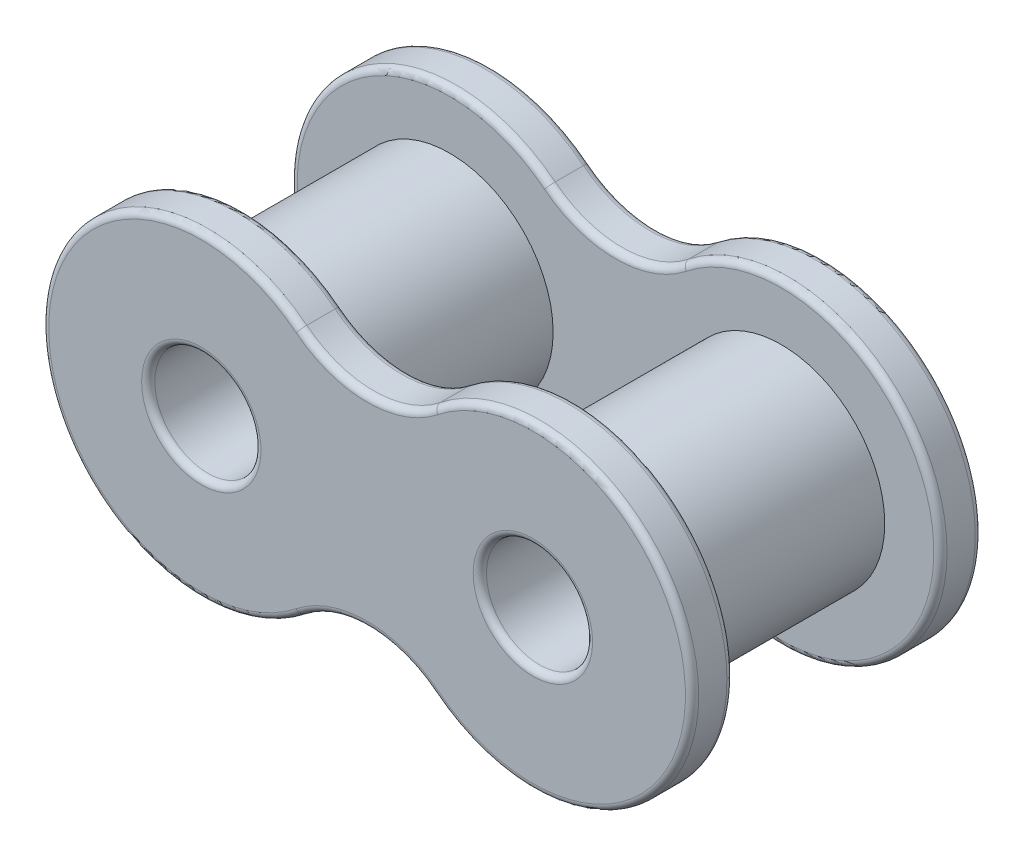
ISO-10303-21;
HEADER;
FILE_DESCRIPTION(('STEP AP214'),'2;1');
FILE_NAME('part.step','',(''),(''),'','','');
FILE_SCHEMA(('AUTOMOTIVE_DESIGN { 1 0 10303 214 1 1 1 1 }'));
ENDSEC;
DATA;
#1=APPLICATION_CONTEXT('core data for automotive mechanical design processes');
#2=APPLICATION_PROTOCOL_DEFINITION('international standard','automotive_design',2000,#1);
#3=PRODUCT_CONTEXT('',#1,'mechanical');
#4=PRODUCT('Part','Part','',(#3));
#5=PRODUCT_RELATED_PRODUCT_CATEGORY('part','',(#4));
#6=PRODUCT_DEFINITION_FORMATION('','',#4);
#7=PRODUCT_DEFINITION_CONTEXT('part definition',#1,'design');
#8=PRODUCT_DEFINITION('design','',#6,#7);
#9=PRODUCT_DEFINITION_SHAPE('','',#8);
#10=(LENGTH_UNIT() NAMED_UNIT(*) SI_UNIT(.MILLI.,.METRE.));
#11=(NAMED_UNIT(*) PLANE_ANGLE_UNIT() SI_UNIT($,.RADIAN.));
#12=(NAMED_UNIT(*) SI_UNIT($,.STERADIAN.) SOLID_ANGLE_UNIT());
#13=UNCERTAINTY_MEASURE_WITH_UNIT(LENGTH_MEASURE(1.E-05),#10,'distance_accuracy_value','');
#14=(GEOMETRIC_REPRESENTATION_CONTEXT(3) GLOBAL_UNCERTAINTY_ASSIGNED_CONTEXT((#13)) GLOBAL_UNIT_ASSIGNED_CONTEXT((#10,
#11,#12)) REPRESENTATION_CONTEXT('',''));
#15=CARTESIAN_POINT('',(0.,0.,0.));
#16=DIRECTION('',(0.,0.,1.));
#17=DIRECTION('',(1.,0.,0.));
#18=AXIS2_PLACEMENT_3D('',#15,#16,#17);
#19=CARTESIAN_POINT('',(3.175,4.,1.5875));
#20=DIRECTION('',(0.,0.,1.));
#21=DIRECTION('',(1.,0.,0.));
#22=AXIS2_PLACEMENT_3D('',#19,#20,#21);
#23=PLANE('',#22);
#24=CARTESIAN_POINT('',(6.35,0.,1.5875));
#25=DIRECTION('',(0.,0.,1.));
#26=DIRECTION('',(1.,0.,0.));
#27=AXIS2_PLACEMENT_3D('',#24,#25,#26);
#28=CIRCLE('',#27,3.9624);
#29=CARTESIAN_POINT('',(10.3124,0.,1.5875));
#30=VERTEX_POINT('',#29);
#31=EDGE_CURVE('E259',#30,#30,#28,.T.);
#32=ORIENTED_EDGE('',*,*,#31,.F.);
#33=EDGE_LOOP('',(#32));
#34=FACE_BOUND('',#33,.T.);
#35=CARTESIAN_POINT('',(-6.35,0.,1.5875));
#36=DIRECTION('',(0.,0.,1.));
#37=DIRECTION('',(1.,0.,0.));
#38=AXIS2_PLACEMENT_3D('',#35,#36,#37);
#39=CIRCLE('',#38,3.9624);
#40=CARTESIAN_POINT('',(-2.3876,0.,1.5875));
#41=VERTEX_POINT('',#40);
#42=EDGE_CURVE('E418',#41,#41,#39,.T.);
#43=ORIENTED_EDGE('',*,*,#42,.F.);
#44=EDGE_LOOP('',(#43));
#45=FACE_BOUND('',#44,.T.);
#46=CARTESIAN_POINT('',(0.,-8.,1.5875));
#47=DIRECTION('',(0.,0.,1.));
#48=DIRECTION('',(1.,0.,0.));
#49=AXIS2_PLACEMENT_3D('',#46,#47,#48);
#50=CIRCLE('',#49,4.37183865155505);
#51=CARTESIAN_POINT('',(-2.71799627783899,-4.57575272083278,1.5875));
#52=VERTEX_POINT('',#51);
#53=CARTESIAN_POINT('',(2.71799627783898,-4.57575272083277,1.5875));
#54=VERTEX_POINT('',#53);
#55=EDGE_CURVE('E248',#52,#54,#50,.F.);
#56=ORIENTED_EDGE('',*,*,#55,.T.);
#57=CARTESIAN_POINT('',(6.35,0.,1.5875));
#58=DIRECTION('',(0.,0.,1.));
#59=DIRECTION('',(1.,0.,0.));
#60=AXIS2_PLACEMENT_3D('',#57,#58,#59);
#61=CIRCLE('',#60,5.842);
#62=CARTESIAN_POINT('',(2.71799627783899,4.57575272083278,1.5875));
#63=VERTEX_POINT('',#62);
#64=EDGE_CURVE('E251',#54,#63,#61,.T.);
#65=ORIENTED_EDGE('',*,*,#64,.T.);
#66=CARTESIAN_POINT('',(0.,8.,1.5875));
#67=DIRECTION('',(0.,0.,1.));
#68=DIRECTION('',(1.,0.,0.));
#69=AXIS2_PLACEMENT_3D('',#66,#67,#68);
#70=CIRCLE('',#69,4.37183865155505);
#71=CARTESIAN_POINT('',(-2.71799627783899,4.57575272083278,1.5875));
#72=VERTEX_POINT('',#71);
#73=EDGE_CURVE('E242',#63,#72,#70,.F.);
#74=ORIENTED_EDGE('',*,*,#73,.T.);
#75=CARTESIAN_POINT('',(-6.35,0.,1.5875));
#76=DIRECTION('',(0.,0.,1.));
#77=DIRECTION('',(1.,0.,0.));
#78=AXIS2_PLACEMENT_3D('',#75,#76,#77);
#79=CIRCLE('',#78,5.842);
#80=EDGE_CURVE('E245',#72,#52,#79,.T.);
#81=ORIENTED_EDGE('',*,*,#80,.T.);
#82=EDGE_LOOP('',(#56,#65,#74,#81));
#83=FACE_BOUND('',#82,.T.);
#84=ADVANCED_FACE('F39',(#34,#45,#83),#23,.T.);
#85=CARTESIAN_POINT('',(3.175,4.,0.));
#86=DIRECTION('',(0.,0.,1.));
#87=DIRECTION('',(1.,0.,0.));
#88=AXIS2_PLACEMENT_3D('',#85,#86,#87);
#89=PLANE('',#88);
#90=CARTESIAN_POINT('',(6.35,0.,0.));
#91=DIRECTION('',(0.,0.,1.));
#92=DIRECTION('',(1.,0.,0.));
#93=AXIS2_PLACEMENT_3D('',#90,#91,#92);
#94=CIRCLE('',#93,2.286);
#95=CARTESIAN_POINT('',(8.636,0.,0.));
#96=VERTEX_POINT('',#95);
#97=EDGE_CURVE('E190',#96,#96,#94,.T.);
#98=ORIENTED_EDGE('',*,*,#97,.T.);
#99=EDGE_LOOP('',(#98));
#100=FACE_BOUND('',#99,.T.);
#101=CARTESIAN_POINT('',(-6.35,0.,0.));
#102=DIRECTION('',(0.,0.,1.));
#103=DIRECTION('',(1.,0.,0.));
#104=AXIS2_PLACEMENT_3D('',#101,#102,#103);
#105=CIRCLE('',#104,2.286);
#106=CARTESIAN_POINT('',(-4.064,0.,0.));
#107=VERTEX_POINT('',#106);
#108=EDGE_CURVE('E185',#107,#107,#105,.T.);
#109=ORIENTED_EDGE('',*,*,#108,.T.);
#110=EDGE_LOOP('',(#109));
#111=FACE_BOUND('',#110,.T.);
#112=CARTESIAN_POINT('',(0.,-8.,0.));
#113=DIRECTION('',(0.,0.,1.));
#114=DIRECTION('',(1.,0.,0.));
#115=AXIS2_PLACEMENT_3D('',#112,#113,#114);
#116=CIRCLE('',#115,4.37183865155505);
#117=CARTESIAN_POINT('',(2.71799627783898,-4.57575272083277,0.));
#118=VERTEX_POINT('',#117);
#119=CARTESIAN_POINT('',(-2.71799627783899,-4.57575272083278,0.));
#120=VERTEX_POINT('',#119);
#121=EDGE_CURVE('E183',#118,#120,#116,.T.);
#122=ORIENTED_EDGE('',*,*,#121,.T.);
#123=CARTESIAN_POINT('',(-6.35,0.,0.));
#124=DIRECTION('',(0.,0.,1.));
#125=DIRECTION('',(1.,0.,0.));
#126=AXIS2_PLACEMENT_3D('',#123,#124,#125);
#127=CIRCLE('',#126,5.842);
#128=CARTESIAN_POINT('',(-2.71799627783899,4.57575272083278,0.));
#129=VERTEX_POINT('',#128);
#130=EDGE_CURVE('E160',#120,#129,#127,.F.);
#131=ORIENTED_EDGE('',*,*,#130,.T.);
#132=CARTESIAN_POINT('',(0.,8.,0.));
#133=DIRECTION('',(0.,0.,1.));
#134=DIRECTION('',(1.,0.,0.));
#135=AXIS2_PLACEMENT_3D('',#132,#133,#134);
#136=CIRCLE('',#135,4.37183865155505);
#137=CARTESIAN_POINT('',(2.71799627783899,4.57575272083278,0.));
#138=VERTEX_POINT('',#137);
#139=EDGE_CURVE('E171',#129,#138,#136,.T.);
#140=ORIENTED_EDGE('',*,*,#139,.T.);
#141=CARTESIAN_POINT('',(6.35,0.,0.));
#142=DIRECTION('',(0.,0.,1.));
#143=DIRECTION('',(1.,0.,0.));
#144=AXIS2_PLACEMENT_3D('',#141,#142,#143);
#145=CIRCLE('',#144,5.842);
#146=EDGE_CURVE('E178',#138,#118,#145,.F.);
#147=ORIENTED_EDGE('',*,*,#146,.T.);
#148=EDGE_LOOP('',(#122,#131,#140,#147));
#149=FACE_BOUND('',#148,.T.);
#150=ADVANCED_FACE('F181',(#100,#111,#149),#89,.F.);
#151=CARTESIAN_POINT('',(0.,8.,1.5875));
#152=DIRECTION('',(0.,0.,-1.));
#153=DIRECTION('',(-1.,0.,0.));
#154=AXIS2_PLACEMENT_3D('',#151,#152,#153);
#155=CYLINDRICAL_SURFACE('',#154,4.11783865155506);
#156=DIRECTION('',(0.,0.,-1.));
#157=VECTOR('',#156,1.);
#158=CARTESIAN_POINT('',(2.56008307252764,4.77469849130376,1.5875));
#159=LINE('',#158,#157);
#160=CARTESIAN_POINT('',(2.56008307252764,4.77469849130376,1.3335));
#161=VERTEX_POINT('',#160);
#162=CARTESIAN_POINT('',(2.56008307252764,4.77469849130376,0.254));
#163=VERTEX_POINT('',#162);
#164=EDGE_CURVE('E268',#161,#163,#159,.T.);
#165=ORIENTED_EDGE('',*,*,#164,.T.);
#166=CARTESIAN_POINT('',(0.,8.,0.254));
#167=DIRECTION('',(0.,0.,1.));
#168=DIRECTION('',(1.,0.,0.));
#169=AXIS2_PLACEMENT_3D('',#166,#167,#168);
#170=CIRCLE('',#169,4.11783865155506);
#171=CARTESIAN_POINT('',(-2.56008307252764,4.77469849130376,0.254));
#172=VERTEX_POINT('',#171);
#173=EDGE_CURVE('E235',#163,#172,#170,.F.);
#174=ORIENTED_EDGE('',*,*,#173,.T.);
#175=DIRECTION('',(0.,0.,-1.));
#176=VECTOR('',#175,1.);
#177=CARTESIAN_POINT('',(-2.56008307252764,4.77469849130376,1.5875));
#178=LINE('',#177,#176);
#179=CARTESIAN_POINT('',(-2.56008307252764,4.77469849130376,1.3335));
#180=VERTEX_POINT('',#179);
#181=EDGE_CURVE('E179',#180,#172,#178,.T.);
#182=ORIENTED_EDGE('',*,*,#181,.F.);
#183=CARTESIAN_POINT('',(0.,8.,1.3335));
#184=DIRECTION('',(0.,0.,1.));
#185=DIRECTION('',(1.,0.,0.));
#186=AXIS2_PLACEMENT_3D('',#183,#184,#185);
#187=CIRCLE('',#186,4.11783865155506);
#188=EDGE_CURVE('E232',#180,#161,#187,.T.);
#189=ORIENTED_EDGE('',*,*,#188,.T.);
#190=EDGE_LOOP('',(#165,#174,#182,#189));
#191=FACE_BOUND('',#190,.T.);
#192=ADVANCED_FACE('F478',(#191),#155,.F.);
#193=CARTESIAN_POINT('',(-6.35,0.,1.5875));
#194=DIRECTION('',(0.,0.,-1.));
#195=DIRECTION('',(-1.,0.,0.));
#196=AXIS2_PLACEMENT_3D('',#193,#194,#195);
#197=CYLINDRICAL_SURFACE('',#196,6.096);
#198=ORIENTED_EDGE('',*,*,#181,.T.);
#199=CARTESIAN_POINT('',(-6.35,0.,0.254));
#200=DIRECTION('',(0.,0.,1.));
#201=DIRECTION('',(1.,0.,0.));
#202=AXIS2_PLACEMENT_3D('',#199,#200,#201);
#203=CIRCLE('',#202,6.096);
#204=CARTESIAN_POINT('',(-2.56008307252764,-4.77469849130376,0.254));
#205=VERTEX_POINT('',#204);
#206=EDGE_CURVE('E163',#172,#205,#203,.T.);
#207=ORIENTED_EDGE('',*,*,#206,.T.);
#208=DIRECTION('',(0.,0.,-1.));
#209=VECTOR('',#208,1.);
#210=CARTESIAN_POINT('',(-2.56008307252764,-4.77469849130376,1.5875));
#211=LINE('',#210,#209);
#212=CARTESIAN_POINT('',(-2.56008307252764,-4.77469849130376,1.3335));
#213=VERTEX_POINT('',#212);
#214=EDGE_CURVE('E432',#213,#205,#211,.T.);
#215=ORIENTED_EDGE('',*,*,#214,.F.);
#216=CARTESIAN_POINT('',(-6.35,0.,1.3335));
#217=DIRECTION('',(0.,0.,1.));
#218=DIRECTION('',(1.,0.,0.));
#219=AXIS2_PLACEMENT_3D('',#216,#217,#218);
#220=CIRCLE('',#219,6.096);
#221=EDGE_CURVE('E214',#213,#180,#220,.F.);
#222=ORIENTED_EDGE('',*,*,#221,.T.);
#223=EDGE_LOOP('',(#198,#207,#215,#222));
#224=FACE_BOUND('',#223,.T.);
#225=ADVANCED_FACE('F450',(#224),#197,.T.);
#226=CARTESIAN_POINT('',(0.,-8.,1.5875));
#227=DIRECTION('',(0.,0.,-1.));
#228=DIRECTION('',(-1.,0.,0.));
#229=AXIS2_PLACEMENT_3D('',#226,#227,#228);
#230=CYLINDRICAL_SURFACE('',#229,4.11783865155506);
#231=ORIENTED_EDGE('',*,*,#214,.T.);
#232=CARTESIAN_POINT('',(0.,-8.,0.254));
#233=DIRECTION('',(0.,0.,1.));
#234=DIRECTION('',(1.,0.,0.));
#235=AXIS2_PLACEMENT_3D('',#232,#233,#234);
#236=CIRCLE('',#235,4.11783865155506);
#237=CARTESIAN_POINT('',(2.56008307252764,-4.77469849130376,0.254));
#238=VERTEX_POINT('',#237);
#239=EDGE_CURVE('E222',#205,#238,#236,.F.);
#240=ORIENTED_EDGE('',*,*,#239,.T.);
#241=DIRECTION('',(0.,0.,-1.));
#242=VECTOR('',#241,1.);
#243=CARTESIAN_POINT('',(2.56008307252764,-4.77469849130376,1.5875));
#244=LINE('',#243,#242);
#245=CARTESIAN_POINT('',(2.56008307252764,-4.77469849130376,1.3335));
#246=VERTEX_POINT('',#245);
#247=EDGE_CURVE('E428',#246,#238,#244,.T.);
#248=ORIENTED_EDGE('',*,*,#247,.F.);
#249=CARTESIAN_POINT('',(0.,-8.,1.3335));
#250=DIRECTION('',(0.,0.,1.));
#251=DIRECTION('',(1.,0.,0.));
#252=AXIS2_PLACEMENT_3D('',#249,#250,#251);
#253=CIRCLE('',#252,4.11783865155506);
#254=EDGE_CURVE('E219',#246,#213,#253,.T.);
#255=ORIENTED_EDGE('',*,*,#254,.T.);
#256=EDGE_LOOP('',(#231,#240,#248,#255));
#257=FACE_BOUND('',#256,.T.);
#258=ADVANCED_FACE('F453',(#257),#230,.F.);
#259=CARTESIAN_POINT('',(6.35,0.,1.5875));
#260=DIRECTION('',(0.,0.,-1.));
#261=DIRECTION('',(-1.,0.,0.));
#262=AXIS2_PLACEMENT_3D('',#259,#260,#261);
#263=CYLINDRICAL_SURFACE('',#262,6.096);
#264=ORIENTED_EDGE('',*,*,#247,.T.);
#265=CARTESIAN_POINT('',(6.35,0.,0.254));
#266=DIRECTION('',(0.,0.,1.));
#267=DIRECTION('',(1.,0.,0.));
#268=AXIS2_PLACEMENT_3D('',#265,#266,#267);
#269=CIRCLE('',#268,6.096);
#270=EDGE_CURVE('E229',#238,#163,#269,.T.);
#271=ORIENTED_EDGE('',*,*,#270,.T.);
#272=ORIENTED_EDGE('',*,*,#164,.F.);
#273=CARTESIAN_POINT('',(6.35,0.,1.3335));
#274=DIRECTION('',(0.,0.,1.));
#275=DIRECTION('',(1.,0.,0.));
#276=AXIS2_PLACEMENT_3D('',#273,#274,#275);
#277=CIRCLE('',#276,6.096);
#278=EDGE_CURVE('E225',#161,#246,#277,.F.);
#279=ORIENTED_EDGE('',*,*,#278,.T.);
#280=EDGE_LOOP('',(#264,#271,#272,#279));
#281=FACE_BOUND('',#280,.T.);
#282=ADVANCED_FACE('F464',(#281),#263,.T.);
#283=CARTESIAN_POINT('',(-6.35,0.,1.5875));
#284=DIRECTION('',(0.,0.,-1.));
#285=DIRECTION('',(-1.,0.,0.));
#286=AXIS2_PLACEMENT_3D('',#283,#284,#285);
#287=CYLINDRICAL_SURFACE('',#286,2.032);
#288=CARTESIAN_POINT('',(-6.35,0.,0.254));
#289=DIRECTION('',(0.,0.,1.));
#290=DIRECTION('',(1.,0.,0.));
#291=AXIS2_PLACEMENT_3D('',#288,#289,#290);
#292=CIRCLE('',#291,2.032);
#293=CARTESIAN_POINT('',(-4.318,0.,0.254));
#294=VERTEX_POINT('',#293);
#295=EDGE_CURVE('E210',#294,#294,#292,.F.);
#296=ORIENTED_EDGE('',*,*,#295,.T.);
#297=EDGE_LOOP('',(#296));
#298=FACE_BOUND('',#297,.T.);
#299=CARTESIAN_POINT('',(-6.35,0.,1.3335));
#300=DIRECTION('',(0.,0.,1.));
#301=DIRECTION('',(1.,0.,0.));
#302=AXIS2_PLACEMENT_3D('',#299,#300,#301);
#303=CIRCLE('',#302,2.032);
#304=CARTESIAN_POINT('',(-4.318,0.,1.3335));
#305=VERTEX_POINT('',#304);
#306=EDGE_CURVE('E206',#305,#305,#303,.T.);
#307=ORIENTED_EDGE('',*,*,#306,.T.);
#308=EDGE_LOOP('',(#307));
#309=FACE_BOUND('',#308,.T.);
#310=ADVANCED_FACE('F497',(#298,#309),#287,.F.);
#311=CARTESIAN_POINT('',(6.35,0.,1.5875));
#312=DIRECTION('',(0.,0.,-1.));
#313=DIRECTION('',(-1.,0.,0.));
#314=AXIS2_PLACEMENT_3D('',#311,#312,#313);
#315=CYLINDRICAL_SURFACE('',#314,2.032);
#316=CARTESIAN_POINT('',(6.35,0.,0.254));
#317=DIRECTION('',(0.,0.,1.));
#318=DIRECTION('',(1.,0.,0.));
#319=AXIS2_PLACEMENT_3D('',#316,#317,#318);
#320=CIRCLE('',#319,2.032);
#321=CARTESIAN_POINT('',(8.382,0.,0.254));
#322=VERTEX_POINT('',#321);
#323=EDGE_CURVE('E202',#322,#322,#320,.F.);
#324=ORIENTED_EDGE('',*,*,#323,.T.);
#325=EDGE_LOOP('',(#324));
#326=FACE_BOUND('',#325,.T.);
#327=CARTESIAN_POINT('',(6.35,0.,1.3335));
#328=DIRECTION('',(0.,0.,1.));
#329=DIRECTION('',(1.,0.,0.));
#330=AXIS2_PLACEMENT_3D('',#327,#328,#329);
#331=CIRCLE('',#330,2.032);
#332=CARTESIAN_POINT('',(8.382,0.,1.3335));
#333=VERTEX_POINT('',#332);
#334=EDGE_CURVE('E198',#333,#333,#331,.T.);
#335=ORIENTED_EDGE('',*,*,#334,.T.);
#336=EDGE_LOOP('',(#335));
#337=FACE_BOUND('',#336,.T.);
#338=ADVANCED_FACE('F517',(#326,#337),#315,.F.);
#339=CARTESIAN_POINT('',(6.35,0.,0.254));
#340=DIRECTION('',(0.,0.,1.));
#341=DIRECTION('',(1.,0.,0.));
#342=AXIS2_PLACEMENT_3D('',#339,#340,#341);
#343=TOROIDAL_SURFACE('',#342,2.286,0.254);
#344=ORIENTED_EDGE('',*,*,#323,.F.);
#345=EDGE_LOOP('',(#344));
#346=FACE_BOUND('',#345,.T.);
#347=ORIENTED_EDGE('',*,*,#97,.F.);
#348=EDGE_LOOP('',(#347));
#349=FACE_BOUND('',#348,.T.);
#350=ADVANCED_FACE('F524',(#346,#349),#343,.T.);
#351=CARTESIAN_POINT('',(-6.35,0.,0.254));
#352=DIRECTION('',(0.,0.,1.));
#353=DIRECTION('',(1.,0.,0.));
#354=AXIS2_PLACEMENT_3D('',#351,#352,#353);
#355=TOROIDAL_SURFACE('',#354,2.286,0.254);
#356=ORIENTED_EDGE('',*,*,#295,.F.);
#357=EDGE_LOOP('',(#356));
#358=FACE_BOUND('',#357,.T.);
#359=ORIENTED_EDGE('',*,*,#108,.F.);
#360=EDGE_LOOP('',(#359));
#361=FACE_BOUND('',#360,.T.);
#362=ADVANCED_FACE('F531',(#358,#361),#355,.T.);
#363=CARTESIAN_POINT('',(6.35,0.,0.254));
#364=DIRECTION('',(0.,0.,1.));
#365=DIRECTION('',(1.,0.,0.));
#366=AXIS2_PLACEMENT_3D('',#363,#364,#365);
#367=TOROIDAL_SURFACE('',#366,5.842,0.254);
#368=CARTESIAN_POINT('',(2.71799627783898,-4.57575272083277,0.254));
#369=DIRECTION('',(-0.783251064846417,0.621705532721845,0.));
#370=DIRECTION('',(-0.621705532721845,-0.783251064846417,0.));
#371=AXIS2_PLACEMENT_3D('',#368,#369,#370);
#372=CIRCLE('',#371,0.254);
#373=EDGE_CURVE('E167',#118,#238,#372,.T.);
#374=ORIENTED_EDGE('',*,*,#373,.F.);
#375=ORIENTED_EDGE('',*,*,#146,.F.);
#376=CARTESIAN_POINT('',(2.71799627783899,4.57575272083278,0.254));
#377=DIRECTION('',(-0.783251064846417,-0.621705532721845,0.));
#378=DIRECTION('',(0.621705532721845,-0.783251064846417,0.));
#379=AXIS2_PLACEMENT_3D('',#376,#377,#378);
#380=CIRCLE('',#379,0.254);
#381=EDGE_CURVE('E174',#163,#138,#380,.T.);
#382=ORIENTED_EDGE('',*,*,#381,.F.);
#383=ORIENTED_EDGE('',*,*,#270,.F.);
#384=EDGE_LOOP('',(#374,#375,#382,#383));
#385=FACE_BOUND('',#384,.T.);
#386=ADVANCED_FACE('F442',(#385),#367,.T.);
#387=CARTESIAN_POINT('',(0.,8.,0.254));
#388=DIRECTION('',(0.,0.,1.));
#389=DIRECTION('',(1.,0.,0.));
#390=AXIS2_PLACEMENT_3D('',#387,#388,#389);
#391=TOROIDAL_SURFACE('',#390,4.37183865155505,0.254);
#392=ORIENTED_EDGE('',*,*,#381,.T.);
#393=ORIENTED_EDGE('',*,*,#139,.F.);
#394=CARTESIAN_POINT('',(-2.71799627783899,4.57575272083278,0.254));
#395=DIRECTION('',(-0.783251064846417,0.621705532721845,0.));
#396=DIRECTION('',(-0.621705532721845,-0.783251064846417,0.));
#397=AXIS2_PLACEMENT_3D('',#394,#395,#396);
#398=CIRCLE('',#397,0.254);
#399=EDGE_CURVE('E156',#172,#129,#398,.T.);
#400=ORIENTED_EDGE('',*,*,#399,.F.);
#401=ORIENTED_EDGE('',*,*,#173,.F.);
#402=EDGE_LOOP('',(#392,#393,#400,#401));
#403=FACE_BOUND('',#402,.T.);
#404=ADVANCED_FACE('F172',(#403),#391,.T.);
#405=CARTESIAN_POINT('',(0.,-8.,0.254));
#406=DIRECTION('',(0.,0.,1.));
#407=DIRECTION('',(1.,0.,0.));
#408=AXIS2_PLACEMENT_3D('',#405,#406,#407);
#409=TOROIDAL_SURFACE('',#408,4.37183865155505,0.254);
#410=ORIENTED_EDGE('',*,*,#373,.T.);
#411=ORIENTED_EDGE('',*,*,#239,.F.);
#412=CARTESIAN_POINT('',(-2.71799627783899,-4.57575272083278,0.254));
#413=DIRECTION('',(-0.783251064846418,-0.621705532721845,0.));
#414=DIRECTION('',(0.621705532721845,-0.783251064846418,0.));
#415=AXIS2_PLACEMENT_3D('',#412,#413,#414);
#416=CIRCLE('',#415,0.254);
#417=EDGE_CURVE('E168',#120,#205,#416,.T.);
#418=ORIENTED_EDGE('',*,*,#417,.F.);
#419=ORIENTED_EDGE('',*,*,#121,.F.);
#420=EDGE_LOOP('',(#410,#411,#418,#419));
#421=FACE_BOUND('',#420,.T.);
#422=ADVANCED_FACE('F445',(#421),#409,.T.);
#423=CARTESIAN_POINT('',(-6.35,0.,0.254));
#424=DIRECTION('',(0.,0.,1.));
#425=DIRECTION('',(1.,0.,0.));
#426=AXIS2_PLACEMENT_3D('',#423,#424,#425);
#427=TOROIDAL_SURFACE('',#426,5.842,0.254);
#428=ORIENTED_EDGE('',*,*,#399,.T.);
#429=ORIENTED_EDGE('',*,*,#130,.F.);
#430=ORIENTED_EDGE('',*,*,#417,.T.);
#431=ORIENTED_EDGE('',*,*,#206,.F.);
#432=EDGE_LOOP('',(#428,#429,#430,#431));
#433=FACE_BOUND('',#432,.T.);
#434=ADVANCED_FACE('F158',(#433),#427,.T.);
#435=CARTESIAN_POINT('',(6.35,0.,1.3335));
#436=DIRECTION('',(0.,0.,1.));
#437=DIRECTION('',(1.,0.,0.));
#438=AXIS2_PLACEMENT_3D('',#435,#436,#437);
#439=TOROIDAL_SURFACE('',#438,2.286,0.254);
#440=CARTESIAN_POINT('',(6.35,0.,1.5875));
#441=DIRECTION('',(0.,0.,1.));
#442=DIRECTION('',(1.,0.,0.));
#443=AXIS2_PLACEMENT_3D('',#440,#441,#442);
#444=CIRCLE('',#443,2.286);
#445=CARTESIAN_POINT('',(8.636,0.,1.5875));
#446=VERTEX_POINT('',#445);
#447=EDGE_CURVE('E255',#446,#446,#444,.F.);
#448=ORIENTED_EDGE('',*,*,#447,.F.);
#449=EDGE_LOOP('',(#448));
#450=FACE_BOUND('',#449,.T.);
#451=ORIENTED_EDGE('',*,*,#334,.F.);
#452=EDGE_LOOP('',(#451));
#453=FACE_BOUND('',#452,.T.);
#454=ADVANCED_FACE('F563',(#450,#453),#439,.T.);
#455=CARTESIAN_POINT('',(-6.35,0.,1.3335));
#456=DIRECTION('',(0.,0.,1.));
#457=DIRECTION('',(1.,0.,0.));
#458=AXIS2_PLACEMENT_3D('',#455,#456,#457);
#459=TOROIDAL_SURFACE('',#458,5.842,0.254);
#460=CARTESIAN_POINT('',(-2.71799627783899,4.57575272083278,1.3335));
#461=DIRECTION('',(0.783251064846417,-0.621705532721845,0.));
#462=DIRECTION('',(0.621705532721845,0.783251064846417,0.));
#463=AXIS2_PLACEMENT_3D('',#460,#461,#462);
#464=CIRCLE('',#463,0.254);
#465=EDGE_CURVE('E276',#180,#72,#464,.T.);
#466=ORIENTED_EDGE('',*,*,#465,.F.);
#467=ORIENTED_EDGE('',*,*,#221,.F.);
#468=CARTESIAN_POINT('',(-2.71799627783899,-4.57575272083278,1.3335));
#469=DIRECTION('',(0.783251064846417,0.621705532721845,0.));
#470=DIRECTION('',(-0.621705532721845,0.783251064846417,0.));
#471=AXIS2_PLACEMENT_3D('',#468,#469,#470);
#472=CIRCLE('',#471,0.254);
#473=EDGE_CURVE('E261',#52,#213,#472,.T.);
#474=ORIENTED_EDGE('',*,*,#473,.F.);
#475=ORIENTED_EDGE('',*,*,#80,.F.);
#476=EDGE_LOOP('',(#466,#467,#474,#475));
#477=FACE_BOUND('',#476,.T.);
#478=ADVANCED_FACE('F476',(#477),#459,.T.);
#479=CARTESIAN_POINT('',(0.,-8.,1.3335));
#480=DIRECTION('',(0.,0.,1.));
#481=DIRECTION('',(1.,0.,0.));
#482=AXIS2_PLACEMENT_3D('',#479,#480,#481);
#483=TOROIDAL_SURFACE('',#482,4.37183865155505,0.254);
#484=ORIENTED_EDGE('',*,*,#473,.T.);
#485=ORIENTED_EDGE('',*,*,#254,.F.);
#486=CARTESIAN_POINT('',(2.71799627783898,-4.57575272083277,1.3335));
#487=DIRECTION('',(0.783251064846417,-0.621705532721845,0.));
#488=DIRECTION('',(0.621705532721845,0.783251064846417,0.));
#489=AXIS2_PLACEMENT_3D('',#486,#487,#488);
#490=CIRCLE('',#489,0.254);
#491=EDGE_CURVE('E272',#54,#246,#490,.T.);
#492=ORIENTED_EDGE('',*,*,#491,.F.);
#493=ORIENTED_EDGE('',*,*,#55,.F.);
#494=EDGE_LOOP('',(#484,#485,#492,#493));
#495=FACE_BOUND('',#494,.T.);
#496=ADVANCED_FACE('F457',(#495),#483,.T.);
#497=CARTESIAN_POINT('',(0.,8.,1.3335));
#498=DIRECTION('',(0.,0.,1.));
#499=DIRECTION('',(1.,0.,0.));
#500=AXIS2_PLACEMENT_3D('',#497,#498,#499);
#501=TOROIDAL_SURFACE('',#500,4.37183865155505,0.254);
#502=ORIENTED_EDGE('',*,*,#465,.T.);
#503=ORIENTED_EDGE('',*,*,#73,.F.);
#504=CARTESIAN_POINT('',(2.71799627783899,4.57575272083278,1.3335));
#505=DIRECTION('',(0.783251064846417,0.621705532721845,0.));
#506=DIRECTION('',(-0.621705532721845,0.783251064846417,0.));
#507=AXIS2_PLACEMENT_3D('',#504,#505,#506);
#508=CIRCLE('',#507,0.254);
#509=EDGE_CURVE('E269',#161,#63,#508,.T.);
#510=ORIENTED_EDGE('',*,*,#509,.F.);
#511=ORIENTED_EDGE('',*,*,#188,.F.);
#512=EDGE_LOOP('',(#502,#503,#510,#511));
#513=FACE_BOUND('',#512,.T.);
#514=ADVANCED_FACE('F471',(#513),#501,.T.);
#515=CARTESIAN_POINT('',(6.35,0.,1.3335));
#516=DIRECTION('',(0.,0.,1.));
#517=DIRECTION('',(1.,0.,0.));
#518=AXIS2_PLACEMENT_3D('',#515,#516,#517);
#519=TOROIDAL_SURFACE('',#518,5.842,0.254);
#520=ORIENTED_EDGE('',*,*,#491,.T.);
#521=ORIENTED_EDGE('',*,*,#278,.F.);
#522=ORIENTED_EDGE('',*,*,#509,.T.);
#523=ORIENTED_EDGE('',*,*,#64,.F.);
#524=EDGE_LOOP('',(#520,#521,#522,#523));
#525=FACE_BOUND('',#524,.T.);
#526=ADVANCED_FACE('F467',(#525),#519,.T.);
#527=CARTESIAN_POINT('',(-6.35,0.,1.3335));
#528=DIRECTION('',(0.,0.,1.));
#529=DIRECTION('',(1.,0.,0.));
#530=AXIS2_PLACEMENT_3D('',#527,#528,#529);
#531=TOROIDAL_SURFACE('',#530,2.286,0.254);
#532=CARTESIAN_POINT('',(-6.35,0.,1.5875));
#533=DIRECTION('',(0.,0.,1.));
#534=DIRECTION('',(1.,0.,0.));
#535=AXIS2_PLACEMENT_3D('',#532,#533,#534);
#536=CIRCLE('',#535,2.286);
#537=CARTESIAN_POINT('',(-4.064,0.,1.5875));
#538=VERTEX_POINT('',#537);
#539=EDGE_CURVE('E238',#538,#538,#536,.F.);
#540=ORIENTED_EDGE('',*,*,#539,.F.);
#541=EDGE_LOOP('',(#540));
#542=FACE_BOUND('',#541,.T.);
#543=ORIENTED_EDGE('',*,*,#306,.F.);
#544=EDGE_LOOP('',(#543));
#545=FACE_BOUND('',#544,.T.);
#546=ADVANCED_FACE('F595',(#542,#545),#531,.T.);
#547=CARTESIAN_POINT('',(-6.35,0.,1.5875));
#548=DIRECTION('',(0.,0.,1.));
#549=DIRECTION('',(1.,0.,0.));
#550=AXIS2_PLACEMENT_3D('',#547,#548,#549);
#551=PLANE('',#550);
#552=CARTESIAN_POINT('',(-6.35,0.,1.5875));
#553=DIRECTION('',(0.,0.,1.));
#554=DIRECTION('',(1.,0.,0.));
#555=AXIS2_PLACEMENT_3D('',#552,#553,#554);
#556=CIRCLE('',#555,2.032);
#557=CARTESIAN_POINT('',(-4.318,0.,1.5875));
#558=VERTEX_POINT('',#557);
#559=EDGE_CURVE('E411',#558,#558,#556,.T.);
#560=ORIENTED_EDGE('',*,*,#559,.T.);
#561=EDGE_LOOP('',(#560));
#562=FACE_BOUND('',#561,.T.);
#563=ORIENTED_EDGE('',*,*,#539,.T.);
#564=EDGE_LOOP('',(#563));
#565=FACE_BOUND('',#564,.T.);
#566=ADVANCED_FACE('F602',(#562,#565),#551,.F.);
#567=CARTESIAN_POINT('',(-6.35,0.,9.5123));
#568=DIRECTION('',(0.,0.,-1.));
#569=DIRECTION('',(-1.,0.,0.));
#570=AXIS2_PLACEMENT_3D('',#567,#568,#569);
#571=CYLINDRICAL_SURFACE('',#570,3.9624);
#572=CARTESIAN_POINT('',(-6.35,0.,9.5123));
#573=DIRECTION('',(0.,0.,1.));
#574=DIRECTION('',(1.,0.,0.));
#575=AXIS2_PLACEMENT_3D('',#572,#573,#574);
#576=CIRCLE('',#575,3.9624);
#577=CARTESIAN_POINT('',(-2.3876,0.,9.5123));
#578=VERTEX_POINT('',#577);
#579=EDGE_CURVE('E273',#578,#578,#576,.T.);
#580=ORIENTED_EDGE('',*,*,#579,.F.);
#581=EDGE_LOOP('',(#580));
#582=FACE_BOUND('',#581,.T.);
#583=ORIENTED_EDGE('',*,*,#42,.T.);
#584=EDGE_LOOP('',(#583));
#585=FACE_BOUND('',#584,.T.);
#586=ADVANCED_FACE('F610',(#582,#585),#571,.T.);
#587=CARTESIAN_POINT('',(-6.35,0.,9.5123));
#588=DIRECTION('',(0.,0.,-1.));
#589=DIRECTION('',(-1.,0.,0.));
#590=AXIS2_PLACEMENT_3D('',#587,#588,#589);
#591=CYLINDRICAL_SURFACE('',#590,2.032);
#592=CARTESIAN_POINT('',(-6.35,0.,10.8458));
#593=DIRECTION('',(0.,0.,-1.));
#594=DIRECTION('',(-1.,0.,0.));
#595=AXIS2_PLACEMENT_3D('',#592,#593,#594);
#596=CIRCLE('',#595,2.032);
#597=CARTESIAN_POINT('',(-8.382,0.,10.8458));
#598=VERTEX_POINT('',#597);
#599=EDGE_CURVE('E49',#598,#598,#596,.F.);
#600=ORIENTED_EDGE('',*,*,#599,.T.);
#601=EDGE_LOOP('',(#600));
#602=FACE_BOUND('',#601,.T.);
#603=ORIENTED_EDGE('',*,*,#559,.F.);
#604=EDGE_LOOP('',(#603));
#605=FACE_BOUND('',#604,.T.);
#606=ADVANCED_FACE('F618',(#602,#605),#591,.F.);
#607=CARTESIAN_POINT('',(6.35,0.,1.5875));
#608=DIRECTION('',(0.,0.,1.));
#609=DIRECTION('',(-1.,0.,0.));
#610=AXIS2_PLACEMENT_3D('',#607,#608,#609);
#611=PLANE('',#610);
#612=CARTESIAN_POINT('',(6.35,0.,1.5875));
#613=DIRECTION('',(0.,0.,-1.));
#614=DIRECTION('',(-1.,0.,0.));
#615=AXIS2_PLACEMENT_3D('',#612,#613,#614);
#616=CIRCLE('',#615,2.032);
#617=CARTESIAN_POINT('',(4.318,0.,1.5875));
#618=VERTEX_POINT('',#617);
#619=EDGE_CURVE('E407',#618,#618,#616,.T.);
#620=ORIENTED_EDGE('',*,*,#619,.F.);
#621=EDGE_LOOP('',(#620));
#622=FACE_BOUND('',#621,.T.);
#623=ORIENTED_EDGE('',*,*,#447,.T.);
#624=EDGE_LOOP('',(#623));
#625=FACE_BOUND('',#624,.T.);
#626=ADVANCED_FACE('F626',(#622,#625),#611,.F.);
#627=CARTESIAN_POINT('',(6.35,0.,9.5123));
#628=DIRECTION('',(0.,0.,-1.));
#629=DIRECTION('',(-1.,0.,0.));
#630=AXIS2_PLACEMENT_3D('',#627,#628,#629);
#631=CYLINDRICAL_SURFACE('',#630,3.9624);
#632=CARTESIAN_POINT('',(6.35,0.,9.5123));
#633=DIRECTION('',(0.,0.,-1.));
#634=DIRECTION('',(-1.,0.,0.));
#635=AXIS2_PLACEMENT_3D('',#632,#633,#634);
#636=CIRCLE('',#635,3.9624);
#637=CARTESIAN_POINT('',(2.3876,0.,9.5123));
#638=VERTEX_POINT('',#637);
#639=EDGE_CURVE('E406',#638,#638,#636,.T.);
#640=ORIENTED_EDGE('',*,*,#639,.T.);
#641=EDGE_LOOP('',(#640));
#642=FACE_BOUND('',#641,.T.);
#643=ORIENTED_EDGE('',*,*,#31,.T.);
#644=EDGE_LOOP('',(#643));
#645=FACE_BOUND('',#644,.T.);
#646=ADVANCED_FACE('F636',(#642,#645),#631,.T.);
#647=CARTESIAN_POINT('',(6.35,0.,9.5123));
#648=DIRECTION('',(0.,0.,-1.));
#649=DIRECTION('',(-1.,0.,0.));
#650=AXIS2_PLACEMENT_3D('',#647,#648,#649);
#651=CYLINDRICAL_SURFACE('',#650,2.032);
#652=CARTESIAN_POINT('',(6.35,0.,10.8458));
#653=DIRECTION('',(0.,0.,-1.));
#654=DIRECTION('',(-1.,0.,0.));
#655=AXIS2_PLACEMENT_3D('',#652,#653,#654);
#656=CIRCLE('',#655,2.032);
#657=CARTESIAN_POINT('',(4.318,0.,10.8458));
#658=VERTEX_POINT('',#657);
#659=EDGE_CURVE('E11',#658,#658,#656,.F.);
#660=ORIENTED_EDGE('',*,*,#659,.T.);
#661=EDGE_LOOP('',(#660));
#662=FACE_BOUND('',#661,.T.);
#663=ORIENTED_EDGE('',*,*,#619,.T.);
#664=EDGE_LOOP('',(#663));
#665=FACE_BOUND('',#664,.T.);
#666=ADVANCED_FACE('F643',(#662,#665),#651,.F.);
#667=CARTESIAN_POINT('',(3.175,4.,9.5123));
#668=DIRECTION('',(0.,0.,-1.));
#669=DIRECTION('',(1.,0.,0.));
#670=AXIS2_PLACEMENT_3D('',#667,#668,#669);
#671=PLANE('',#670);
#672=CARTESIAN_POINT('',(0.,8.,9.5123));
#673=DIRECTION('',(0.,0.,-1.));
#674=DIRECTION('',(-1.,0.,0.));
#675=AXIS2_PLACEMENT_3D('',#672,#673,#674);
#676=CIRCLE('',#675,4.37183865155505);
#677=CARTESIAN_POINT('',(-2.71799627783899,4.57575272083278,9.5123));
#678=VERTEX_POINT('',#677);
#679=CARTESIAN_POINT('',(2.71799627783899,4.57575272083278,9.5123));
#680=VERTEX_POINT('',#679);
#681=EDGE_CURVE('E294',#678,#680,#676,.F.);
#682=ORIENTED_EDGE('',*,*,#681,.T.);
#683=CARTESIAN_POINT('',(6.35,0.,9.5123));
#684=DIRECTION('',(0.,0.,-1.));
#685=DIRECTION('',(-1.,0.,0.));
#686=AXIS2_PLACEMENT_3D('',#683,#684,#685);
#687=CIRCLE('',#686,5.842);
#688=CARTESIAN_POINT('',(2.71799627783898,-4.57575272083277,9.5123));
#689=VERTEX_POINT('',#688);
#690=EDGE_CURVE('E303',#680,#689,#687,.T.);
#691=ORIENTED_EDGE('',*,*,#690,.T.);
#692=CARTESIAN_POINT('',(0.,-8.,9.5123));
#693=DIRECTION('',(0.,0.,-1.));
#694=DIRECTION('',(-1.,0.,0.));
#695=AXIS2_PLACEMENT_3D('',#692,#693,#694);
#696=CIRCLE('',#695,4.37183865155505);
#697=CARTESIAN_POINT('',(-2.71799627783899,-4.57575272083278,9.5123));
#698=VERTEX_POINT('',#697);
#699=EDGE_CURVE('E300',#689,#698,#696,.F.);
#700=ORIENTED_EDGE('',*,*,#699,.T.);
#701=CARTESIAN_POINT('',(-6.35,0.,9.5123));
#702=DIRECTION('',(0.,0.,-1.));
#703=DIRECTION('',(-1.,0.,0.));
#704=AXIS2_PLACEMENT_3D('',#701,#702,#703);
#705=CIRCLE('',#704,5.842);
#706=EDGE_CURVE('E297',#698,#678,#705,.T.);
#707=ORIENTED_EDGE('',*,*,#706,.T.);
#708=EDGE_LOOP('',(#682,#691,#700,#707));
#709=FACE_BOUND('',#708,.T.);
#710=ORIENTED_EDGE('',*,*,#639,.F.);
#711=EDGE_LOOP('',(#710));
#712=FACE_BOUND('',#711,.T.);
#713=ORIENTED_EDGE('',*,*,#579,.T.);
#714=EDGE_LOOP('',(#713));
#715=FACE_BOUND('',#714,.T.);
#716=ADVANCED_FACE('F650',(#709,#712,#715),#671,.T.);
#717=CARTESIAN_POINT('',(0.,8.,9.5123));
#718=DIRECTION('',(0.,0.,1.));
#719=DIRECTION('',(1.,0.,0.));
#720=AXIS2_PLACEMENT_3D('',#717,#718,#719);
#721=CYLINDRICAL_SURFACE('',#720,4.11783865155506);
#722=DIRECTION('',(0.,0.,1.));
#723=VECTOR('',#722,1.);
#724=CARTESIAN_POINT('',(-2.56008307252764,4.77469849130376,9.5123));
#725=LINE('',#724,#723);
#726=CARTESIAN_POINT('',(-2.56008307252764,4.77469849130376,9.7663));
#727=VERTEX_POINT('',#726);
#728=CARTESIAN_POINT('',(-2.56008307252764,4.77469849130376,10.8458));
#729=VERTEX_POINT('',#728);
#730=EDGE_CURVE('E360',#727,#729,#725,.T.);
#731=ORIENTED_EDGE('',*,*,#730,.T.);
#732=CARTESIAN_POINT('',(0.,8.,10.8458));
#733=DIRECTION('',(0.,0.,-1.));
#734=DIRECTION('',(-1.,0.,0.));
#735=AXIS2_PLACEMENT_3D('',#732,#733,#734);
#736=CIRCLE('',#735,4.11783865155506);
#737=CARTESIAN_POINT('',(2.56008307252764,4.77469849130376,10.8458));
#738=VERTEX_POINT('',#737);
#739=EDGE_CURVE('E340',#729,#738,#736,.F.);
#740=ORIENTED_EDGE('',*,*,#739,.T.);
#741=DIRECTION('',(0.,0.,1.));
#742=VECTOR('',#741,1.);
#743=CARTESIAN_POINT('',(2.56008307252764,4.77469849130376,9.5123));
#744=LINE('',#743,#742);
#745=CARTESIAN_POINT('',(2.56008307252764,4.77469849130376,9.7663));
#746=VERTEX_POINT('',#745);
#747=EDGE_CURVE('E403',#746,#738,#744,.T.);
#748=ORIENTED_EDGE('',*,*,#747,.F.);
#749=CARTESIAN_POINT('',(0.,8.,9.7663));
#750=DIRECTION('',(0.,0.,-1.));
#751=DIRECTION('',(-1.,0.,0.));
#752=AXIS2_PLACEMENT_3D('',#749,#750,#751);
#753=CIRCLE('',#752,4.11783865155506);
#754=EDGE_CURVE('E337',#746,#727,#753,.T.);
#755=ORIENTED_EDGE('',*,*,#754,.T.);
#756=EDGE_LOOP('',(#731,#740,#748,#755));
#757=FACE_BOUND('',#756,.T.);
#758=ADVANCED_FACE('F390',(#757),#721,.F.);
#759=CARTESIAN_POINT('',(6.35,0.,9.5123));
#760=DIRECTION('',(0.,0.,1.));
#761=DIRECTION('',(1.,0.,0.));
#762=AXIS2_PLACEMENT_3D('',#759,#760,#761);
#763=CYLINDRICAL_SURFACE('',#762,6.096);
#764=DIRECTION('',(0.,0.,1.));
#765=VECTOR('',#764,1.);
#766=CARTESIAN_POINT('',(2.56008307252764,-4.77469849130376,9.5123));
#767=LINE('',#766,#765);
#768=CARTESIAN_POINT('',(2.56008307252764,-4.77469849130376,9.7663));
#769=VERTEX_POINT('',#768);
#770=CARTESIAN_POINT('',(2.56008307252764,-4.77469849130376,10.8458));
#771=VERTEX_POINT('',#770);
#772=EDGE_CURVE('E397',#769,#771,#767,.T.);
#773=ORIENTED_EDGE('',*,*,#772,.F.);
#774=CARTESIAN_POINT('',(6.35,0.,9.7663));
#775=DIRECTION('',(0.,0.,-1.));
#776=DIRECTION('',(-1.,0.,0.));
#777=AXIS2_PLACEMENT_3D('',#774,#775,#776);
#778=CIRCLE('',#777,6.096);
#779=EDGE_CURVE('E290',#769,#746,#778,.F.);
#780=ORIENTED_EDGE('',*,*,#779,.T.);
#781=ORIENTED_EDGE('',*,*,#747,.T.);
#782=CARTESIAN_POINT('',(6.35,0.,10.8458));
#783=DIRECTION('',(0.,0.,-1.));
#784=DIRECTION('',(-1.,0.,0.));
#785=AXIS2_PLACEMENT_3D('',#782,#783,#784);
#786=CIRCLE('',#785,6.096);
#787=EDGE_CURVE('E286',#738,#771,#786,.T.);
#788=ORIENTED_EDGE('',*,*,#787,.T.);
#789=EDGE_LOOP('',(#773,#780,#781,#788));
#790=FACE_BOUND('',#789,.T.);
#791=ADVANCED_FACE('F665',(#790),#763,.T.);
#792=CARTESIAN_POINT('',(0.,-8.,9.5123));
#793=DIRECTION('',(0.,0.,1.));
#794=DIRECTION('',(1.,0.,0.));
#795=AXIS2_PLACEMENT_3D('',#792,#793,#794);
#796=CYLINDRICAL_SURFACE('',#795,4.11783865155506);
#797=DIRECTION('',(0.,0.,1.));
#798=VECTOR('',#797,1.);
#799=CARTESIAN_POINT('',(-2.56008307252764,-4.77469849130376,9.5123));
#800=LINE('',#799,#798);
#801=CARTESIAN_POINT('',(-2.56008307252764,-4.77469849130376,9.7663));
#802=VERTEX_POINT('',#801);
#803=CARTESIAN_POINT('',(-2.56008307252764,-4.77469849130376,10.8458));
#804=VERTEX_POINT('',#803);
#805=EDGE_CURVE('E388',#802,#804,#800,.T.);
#806=ORIENTED_EDGE('',*,*,#805,.F.);
#807=CARTESIAN_POINT('',(0.,-8.,9.7663));
#808=DIRECTION('',(0.,0.,-1.));
#809=DIRECTION('',(-1.,0.,0.));
#810=AXIS2_PLACEMENT_3D('',#807,#808,#809);
#811=CIRCLE('',#810,4.11783865155506);
#812=EDGE_CURVE('E310',#802,#769,#811,.T.);
#813=ORIENTED_EDGE('',*,*,#812,.T.);
#814=ORIENTED_EDGE('',*,*,#772,.T.);
#815=CARTESIAN_POINT('',(0.,-8.,10.8458));
#816=DIRECTION('',(0.,0.,-1.));
#817=DIRECTION('',(-1.,0.,0.));
#818=AXIS2_PLACEMENT_3D('',#815,#816,#817);
#819=CIRCLE('',#818,4.11783865155506);
#820=EDGE_CURVE('E307',#771,#804,#819,.F.);
#821=ORIENTED_EDGE('',*,*,#820,.T.);
#822=EDGE_LOOP('',(#806,#813,#814,#821));
#823=FACE_BOUND('',#822,.T.);
#824=ADVANCED_FACE('F672',(#823),#796,.F.);
#825=CARTESIAN_POINT('',(-6.35,0.,9.5123));
#826=DIRECTION('',(0.,0.,1.));
#827=DIRECTION('',(1.,0.,0.));
#828=AXIS2_PLACEMENT_3D('',#825,#826,#827);
#829=CYLINDRICAL_SURFACE('',#828,6.096);
#830=ORIENTED_EDGE('',*,*,#730,.F.);
#831=CARTESIAN_POINT('',(-6.35,0.,9.7663));
#832=DIRECTION('',(0.,0.,-1.));
#833=DIRECTION('',(-1.,0.,0.));
#834=AXIS2_PLACEMENT_3D('',#831,#832,#833);
#835=CIRCLE('',#834,6.096);
#836=EDGE_CURVE('E316',#727,#802,#835,.F.);
#837=ORIENTED_EDGE('',*,*,#836,.T.);
#838=ORIENTED_EDGE('',*,*,#805,.T.);
#839=CARTESIAN_POINT('',(-6.35,0.,10.8458));
#840=DIRECTION('',(0.,0.,-1.));
#841=DIRECTION('',(-1.,0.,0.));
#842=AXIS2_PLACEMENT_3D('',#839,#840,#841);
#843=CIRCLE('',#842,6.096);
#844=EDGE_CURVE('E313',#804,#729,#843,.T.);
#845=ORIENTED_EDGE('',*,*,#844,.T.);
#846=EDGE_LOOP('',(#830,#837,#838,#845));
#847=FACE_BOUND('',#846,.T.);
#848=ADVANCED_FACE('F385',(#847),#829,.T.);
#849=CARTESIAN_POINT('',(3.175,4.,11.0998));
#850=DIRECTION('',(0.,0.,-1.));
#851=DIRECTION('',(1.,0.,0.));
#852=AXIS2_PLACEMENT_3D('',#849,#850,#851);
#853=PLANE('',#852);
#854=CARTESIAN_POINT('',(0.,-8.,11.0998));
#855=DIRECTION('',(0.,0.,-1.));
#856=DIRECTION('',(-1.,0.,0.));
#857=AXIS2_PLACEMENT_3D('',#854,#855,#856);
#858=CIRCLE('',#857,4.37183865155505);
#859=CARTESIAN_POINT('',(-2.71799627783899,-4.57575272083278,11.0998));
#860=VERTEX_POINT('',#859);
#861=CARTESIAN_POINT('',(2.71799627783898,-4.57575272083277,11.0998));
#862=VERTEX_POINT('',#861);
#863=EDGE_CURVE('E57',#860,#862,#858,.T.);
#864=ORIENTED_EDGE('',*,*,#863,.T.);
#865=CARTESIAN_POINT('',(6.35,0.,11.0998));
#866=DIRECTION('',(0.,0.,-1.));
#867=DIRECTION('',(-1.,0.,0.));
#868=AXIS2_PLACEMENT_3D('',#865,#866,#867);
#869=CIRCLE('',#868,5.842);
#870=CARTESIAN_POINT('',(2.71799627783899,4.57575272083278,11.0998));
#871=VERTEX_POINT('',#870);
#872=EDGE_CURVE('E334',#862,#871,#869,.F.);
#873=ORIENTED_EDGE('',*,*,#872,.T.);
#874=CARTESIAN_POINT('',(0.,8.,11.0998));
#875=DIRECTION('',(0.,0.,-1.));
#876=DIRECTION('',(-1.,0.,0.));
#877=AXIS2_PLACEMENT_3D('',#874,#875,#876);
#878=CIRCLE('',#877,4.37183865155505);
#879=CARTESIAN_POINT('',(-2.71799627783899,4.57575272083278,11.0998));
#880=VERTEX_POINT('',#879);
#881=EDGE_CURVE('E327',#871,#880,#878,.T.);
#882=ORIENTED_EDGE('',*,*,#881,.T.);
#883=CARTESIAN_POINT('',(-6.35,0.,11.0998));
#884=DIRECTION('',(0.,0.,-1.));
#885=DIRECTION('',(-1.,0.,0.));
#886=AXIS2_PLACEMENT_3D('',#883,#884,#885);
#887=CIRCLE('',#886,5.842);
#888=EDGE_CURVE('E62',#880,#860,#887,.F.);
#889=ORIENTED_EDGE('',*,*,#888,.T.);
#890=EDGE_LOOP('',(#864,#873,#882,#889));
#891=FACE_BOUND('',#890,.T.);
#892=CARTESIAN_POINT('',(-6.35,0.,11.0998));
#893=DIRECTION('',(0.,0.,-1.));
#894=DIRECTION('',(-1.,0.,0.));
#895=AXIS2_PLACEMENT_3D('',#892,#893,#894);
#896=CIRCLE('',#895,2.286);
#897=CARTESIAN_POINT('',(-8.636,0.,11.0998));
#898=VERTEX_POINT('',#897);
#899=EDGE_CURVE('E323',#898,#898,#896,.T.);
#900=ORIENTED_EDGE('',*,*,#899,.T.);
#901=EDGE_LOOP('',(#900));
#902=FACE_BOUND('',#901,.T.);
#903=CARTESIAN_POINT('',(6.35,0.,11.0998));
#904=DIRECTION('',(0.,0.,-1.));
#905=DIRECTION('',(-1.,0.,0.));
#906=AXIS2_PLACEMENT_3D('',#903,#904,#905);
#907=CIRCLE('',#906,2.286);
#908=CARTESIAN_POINT('',(4.064,0.,11.0998));
#909=VERTEX_POINT('',#908);
#910=EDGE_CURVE('E319',#909,#909,#907,.T.);
#911=ORIENTED_EDGE('',*,*,#910,.T.);
#912=EDGE_LOOP('',(#911));
#913=FACE_BOUND('',#912,.T.);
#914=ADVANCED_FACE('F687',(#891,#902,#913),#853,.F.);
#915=CARTESIAN_POINT('',(-6.35,0.,9.7663));
#916=DIRECTION('',(0.,0.,-1.));
#917=DIRECTION('',(-1.,0.,0.));
#918=AXIS2_PLACEMENT_3D('',#915,#916,#917);
#919=TOROIDAL_SURFACE('',#918,5.842,0.254);
#920=CARTESIAN_POINT('',(-2.71799627783899,4.57575272083278,9.7663));
#921=DIRECTION('',(0.783251064846417,-0.621705532721845,0.));
#922=DIRECTION('',(0.621705532721845,0.783251064846417,0.));
#923=AXIS2_PLACEMENT_3D('',#920,#921,#922);
#924=CIRCLE('',#923,0.254);
#925=EDGE_CURVE('E352',#678,#727,#924,.T.);
#926=ORIENTED_EDGE('',*,*,#925,.F.);
#927=ORIENTED_EDGE('',*,*,#706,.F.);
#928=CARTESIAN_POINT('',(-2.71799627783899,-4.57575272083278,9.7663));
#929=DIRECTION('',(0.783251064846417,0.621705532721845,0.));
#930=DIRECTION('',(-0.621705532721845,0.783251064846417,0.));
#931=AXIS2_PLACEMENT_3D('',#928,#929,#930);
#932=CIRCLE('',#931,0.254);
#933=EDGE_CURVE('E356',#802,#698,#932,.T.);
#934=ORIENTED_EDGE('',*,*,#933,.F.);
#935=ORIENTED_EDGE('',*,*,#836,.F.);
#936=EDGE_LOOP('',(#926,#927,#934,#935));
#937=FACE_BOUND('',#936,.T.);
#938=ADVANCED_FACE('F694',(#937),#919,.T.);
#939=CARTESIAN_POINT('',(0.,-8.,9.7663));
#940=DIRECTION('',(0.,0.,-1.));
#941=DIRECTION('',(-1.,0.,0.));
#942=AXIS2_PLACEMENT_3D('',#939,#940,#941);
#943=TOROIDAL_SURFACE('',#942,4.37183865155505,0.254);
#944=ORIENTED_EDGE('',*,*,#933,.T.);
#945=ORIENTED_EDGE('',*,*,#699,.F.);
#946=CARTESIAN_POINT('',(2.71799627783898,-4.57575272083277,9.7663));
#947=DIRECTION('',(0.783251064846417,-0.621705532721845,0.));
#948=DIRECTION('',(0.621705532721845,0.783251064846417,0.));
#949=AXIS2_PLACEMENT_3D('',#946,#947,#948);
#950=CIRCLE('',#949,0.254);
#951=EDGE_CURVE('E349',#769,#689,#950,.T.);
#952=ORIENTED_EDGE('',*,*,#951,.F.);
#953=ORIENTED_EDGE('',*,*,#812,.F.);
#954=EDGE_LOOP('',(#944,#945,#952,#953));
#955=FACE_BOUND('',#954,.T.);
#956=ADVANCED_FACE('F701',(#955),#943,.T.);
#957=CARTESIAN_POINT('',(0.,8.,9.7663));
#958=DIRECTION('',(0.,0.,-1.));
#959=DIRECTION('',(-1.,0.,0.));
#960=AXIS2_PLACEMENT_3D('',#957,#958,#959);
#961=TOROIDAL_SURFACE('',#960,4.37183865155505,0.254);
#962=ORIENTED_EDGE('',*,*,#925,.T.);
#963=ORIENTED_EDGE('',*,*,#754,.F.);
#964=CARTESIAN_POINT('',(2.71799627783899,4.57575272083278,9.7663));
#965=DIRECTION('',(0.783251064846417,0.621705532721845,0.));
#966=DIRECTION('',(-0.621705532721845,0.783251064846417,0.));
#967=AXIS2_PLACEMENT_3D('',#964,#965,#966);
#968=CIRCLE('',#967,0.254);
#969=EDGE_CURVE('E346',#680,#746,#968,.T.);
#970=ORIENTED_EDGE('',*,*,#969,.F.);
#971=ORIENTED_EDGE('',*,*,#681,.F.);
#972=EDGE_LOOP('',(#962,#963,#970,#971));
#973=FACE_BOUND('',#972,.T.);
#974=ADVANCED_FACE('F709',(#973),#961,.T.);
#975=CARTESIAN_POINT('',(6.35,0.,9.7663));
#976=DIRECTION('',(0.,0.,-1.));
#977=DIRECTION('',(-1.,0.,0.));
#978=AXIS2_PLACEMENT_3D('',#975,#976,#977);
#979=TOROIDAL_SURFACE('',#978,5.842,0.254);
#980=ORIENTED_EDGE('',*,*,#951,.T.);
#981=ORIENTED_EDGE('',*,*,#690,.F.);
#982=ORIENTED_EDGE('',*,*,#969,.T.);
#983=ORIENTED_EDGE('',*,*,#779,.F.);
#984=EDGE_LOOP('',(#980,#981,#982,#983));
#985=FACE_BOUND('',#984,.T.);
#986=ADVANCED_FACE('F717',(#985),#979,.T.);
#987=CARTESIAN_POINT('',(-6.35,0.,10.8458));
#988=DIRECTION('',(0.,0.,-1.));
#989=DIRECTION('',(-1.,0.,0.));
#990=AXIS2_PLACEMENT_3D('',#987,#988,#989);
#991=TOROIDAL_SURFACE('',#990,5.842,0.254);
#992=CARTESIAN_POINT('',(-2.71799627783899,4.57575272083278,10.8458));
#993=DIRECTION('',(0.783251064846417,-0.621705532721845,0.));
#994=DIRECTION('',(0.621705532721845,0.783251064846417,0.));
#995=AXIS2_PLACEMENT_3D('',#992,#993,#994);
#996=CIRCLE('',#995,0.254);
#997=EDGE_CURVE('E366',#729,#880,#996,.T.);
#998=ORIENTED_EDGE('',*,*,#997,.F.);
#999=ORIENTED_EDGE('',*,*,#844,.F.);
#1000=CARTESIAN_POINT('',(-2.71799627783899,-4.57575272083278,10.8458));
#1001=DIRECTION('',(0.783251064846417,0.621705532721845,0.));
#1002=DIRECTION('',(-0.621705532721845,0.783251064846417,0.));
#1003=AXIS2_PLACEMENT_3D('',#1000,#1001,#1002);
#1004=CIRCLE('',#1003,0.254);
#1005=EDGE_CURVE('E43',#860,#804,#1004,.T.);
#1006=ORIENTED_EDGE('',*,*,#1005,.F.);
#1007=ORIENTED_EDGE('',*,*,#888,.F.);
#1008=EDGE_LOOP('',(#998,#999,#1006,#1007));
#1009=FACE_BOUND('',#1008,.T.);
#1010=ADVANCED_FACE('F380',(#1009),#991,.T.);
#1011=CARTESIAN_POINT('',(0.,-8.,10.8458));
#1012=DIRECTION('',(0.,0.,-1.));
#1013=DIRECTION('',(-1.,0.,0.));
#1014=AXIS2_PLACEMENT_3D('',#1011,#1012,#1013);
#1015=TOROIDAL_SURFACE('',#1014,4.37183865155505,0.254);
#1016=ORIENTED_EDGE('',*,*,#1005,.T.);
#1017=ORIENTED_EDGE('',*,*,#820,.F.);
#1018=CARTESIAN_POINT('',(2.71799627783898,-4.57575272083277,10.8458));
#1019=DIRECTION('',(0.783251064846417,-0.621705532721845,0.));
#1020=DIRECTION('',(0.621705532721845,0.783251064846417,0.));
#1021=AXIS2_PLACEMENT_3D('',#1018,#1019,#1020);
#1022=CIRCLE('',#1021,0.254);
#1023=EDGE_CURVE('E364',#862,#771,#1022,.T.);
#1024=ORIENTED_EDGE('',*,*,#1023,.F.);
#1025=ORIENTED_EDGE('',*,*,#863,.F.);
#1026=EDGE_LOOP('',(#1016,#1017,#1024,#1025));
#1027=FACE_BOUND('',#1026,.T.);
#1028=ADVANCED_FACE('F377',(#1027),#1015,.T.);
#1029=CARTESIAN_POINT('',(0.,8.,10.8458));
#1030=DIRECTION('',(0.,0.,-1.));
#1031=DIRECTION('',(-1.,0.,0.));
#1032=AXIS2_PLACEMENT_3D('',#1029,#1030,#1031);
#1033=TOROIDAL_SURFACE('',#1032,4.37183865155505,0.254);
#1034=ORIENTED_EDGE('',*,*,#997,.T.);
#1035=ORIENTED_EDGE('',*,*,#881,.F.);
#1036=CARTESIAN_POINT('',(2.71799627783899,4.57575272083278,10.8458));
#1037=DIRECTION('',(0.783251064846417,0.621705532721845,0.));
#1038=DIRECTION('',(-0.621705532721845,0.783251064846417,0.));
#1039=AXIS2_PLACEMENT_3D('',#1036,#1037,#1038);
#1040=CIRCLE('',#1039,0.254);
#1041=EDGE_CURVE('E361',#738,#871,#1040,.T.);
#1042=ORIENTED_EDGE('',*,*,#1041,.F.);
#1043=ORIENTED_EDGE('',*,*,#739,.F.);
#1044=EDGE_LOOP('',(#1034,#1035,#1042,#1043));
#1045=FACE_BOUND('',#1044,.T.);
#1046=ADVANCED_FACE('F738',(#1045),#1033,.T.);
#1047=CARTESIAN_POINT('',(6.35,0.,10.8458));
#1048=DIRECTION('',(0.,0.,-1.));
#1049=DIRECTION('',(-1.,0.,0.));
#1050=AXIS2_PLACEMENT_3D('',#1047,#1048,#1049);
#1051=TOROIDAL_SURFACE('',#1050,5.842,0.254);
#1052=ORIENTED_EDGE('',*,*,#1023,.T.);
#1053=ORIENTED_EDGE('',*,*,#787,.F.);
#1054=ORIENTED_EDGE('',*,*,#1041,.T.);
#1055=ORIENTED_EDGE('',*,*,#872,.F.);
#1056=EDGE_LOOP('',(#1052,#1053,#1054,#1055));
#1057=FACE_BOUND('',#1056,.T.);
#1058=ADVANCED_FACE('F745',(#1057),#1051,.T.);
#1059=CARTESIAN_POINT('',(-6.35,0.,10.8458));
#1060=DIRECTION('',(0.,0.,-1.));
#1061=DIRECTION('',(-1.,0.,0.));
#1062=AXIS2_PLACEMENT_3D('',#1059,#1060,#1061);
#1063=TOROIDAL_SURFACE('',#1062,2.286,0.254);
#1064=ORIENTED_EDGE('',*,*,#899,.F.);
#1065=EDGE_LOOP('',(#1064));
#1066=FACE_BOUND('',#1065,.T.);
#1067=ORIENTED_EDGE('',*,*,#599,.F.);
#1068=EDGE_LOOP('',(#1067));
#1069=FACE_BOUND('',#1068,.T.);
#1070=ADVANCED_FACE('F752',(#1066,#1069),#1063,.T.);
#1071=CARTESIAN_POINT('',(6.35,0.,10.8458));
#1072=DIRECTION('',(0.,0.,-1.));
#1073=DIRECTION('',(-1.,0.,0.));
#1074=AXIS2_PLACEMENT_3D('',#1071,#1072,#1073);
#1075=TOROIDAL_SURFACE('',#1074,2.286,0.254);
#1076=ORIENTED_EDGE('',*,*,#910,.F.);
#1077=EDGE_LOOP('',(#1076));
#1078=FACE_BOUND('',#1077,.T.);
#1079=ORIENTED_EDGE('',*,*,#659,.F.);
#1080=EDGE_LOOP('',(#1079));
#1081=FACE_BOUND('',#1080,.T.);
#1082=ADVANCED_FACE('F41',(#1078,#1081),#1075,.T.);
#1083=CLOSED_SHELL('',(#84,#150,#192,#225,#258,#282,#310,#338,#350,#362,#386,#404,#422,#434,
#454,#478,#496,#514,#526,#546,#566,#586,#606,#626,#646,#666,#716,#758,#791,#824,#848,#914,#938,
#956,#974,#986,#1010,#1028,#1046,#1058,#1070,#1082));
#1084=MANIFOLD_SOLID_BREP('B2',#1083);
#1085=ADVANCED_BREP_SHAPE_REPRESENTATION('',(#18,#1084),#14);
#1086=SHAPE_DEFINITION_REPRESENTATION(#9,#1085);
ENDSEC;
END-ISO-10303-21;
